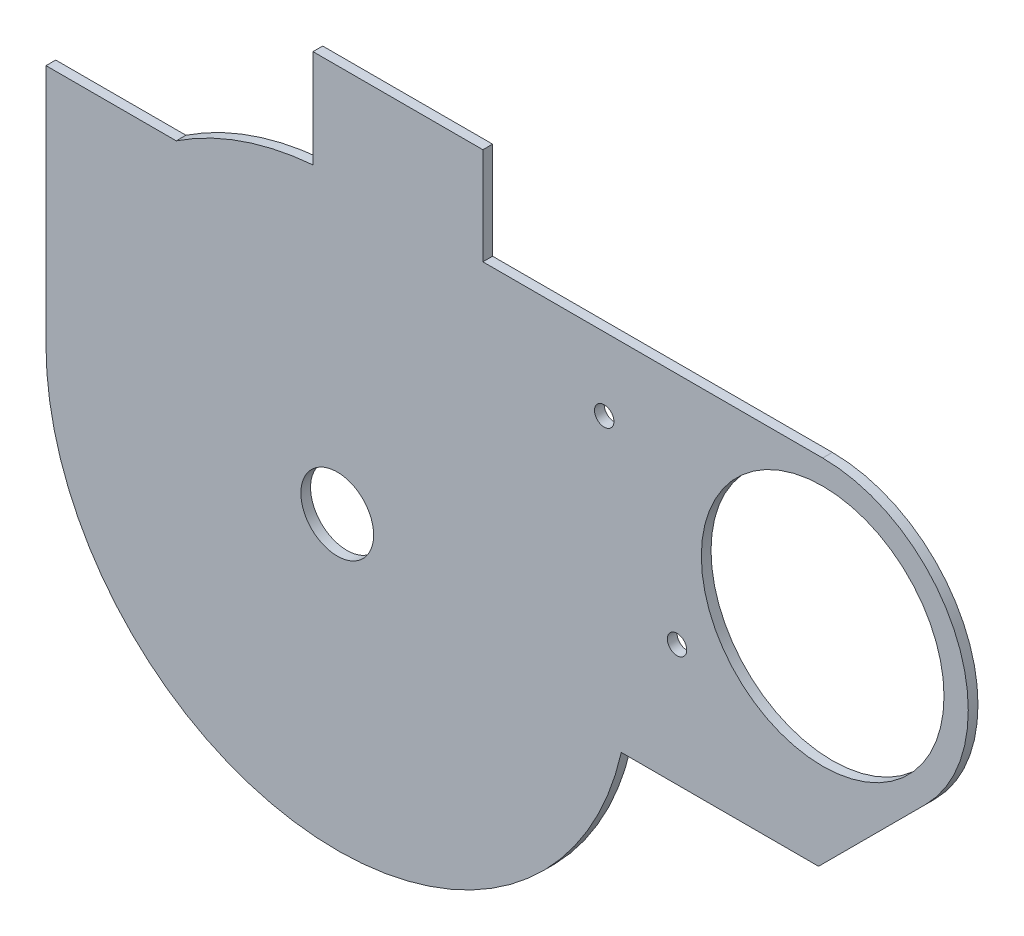
ISO-10303-21;
HEADER;
FILE_DESCRIPTION(('STEP AP214'),'2;1');
FILE_NAME('part.step','',(''),(''),'','','');
FILE_SCHEMA(('AUTOMOTIVE_DESIGN { 1 0 10303 214 1 1 1 1 }'));
ENDSEC;
DATA;
#1=APPLICATION_CONTEXT('core data for automotive mechanical design processes');
#2=APPLICATION_PROTOCOL_DEFINITION('international standard','automotive_design',2000,#1);
#3=PRODUCT_CONTEXT('',#1,'mechanical');
#4=PRODUCT('Part','Part','',(#3));
#5=PRODUCT_RELATED_PRODUCT_CATEGORY('part','',(#4));
#6=PRODUCT_DEFINITION_FORMATION('','',#4);
#7=PRODUCT_DEFINITION_CONTEXT('part definition',#1,'design');
#8=PRODUCT_DEFINITION('design','',#6,#7);
#9=PRODUCT_DEFINITION_SHAPE('','',#8);
#10=(LENGTH_UNIT() NAMED_UNIT(*) SI_UNIT(.MILLI.,.METRE.));
#11=(NAMED_UNIT(*) PLANE_ANGLE_UNIT() SI_UNIT($,.RADIAN.));
#12=(NAMED_UNIT(*) SI_UNIT($,.STERADIAN.) SOLID_ANGLE_UNIT());
#13=UNCERTAINTY_MEASURE_WITH_UNIT(LENGTH_MEASURE(1.E-05),#10,'distance_accuracy_value','');
#14=(GEOMETRIC_REPRESENTATION_CONTEXT(3) GLOBAL_UNCERTAINTY_ASSIGNED_CONTEXT((#13)) GLOBAL_UNIT_ASSIGNED_CONTEXT((#10,
#11,#12)) REPRESENTATION_CONTEXT('',''));
#15=CARTESIAN_POINT('',(0.,0.,0.));
#16=DIRECTION('',(0.,0.,1.));
#17=DIRECTION('',(1.,0.,0.));
#18=AXIS2_PLACEMENT_3D('',#15,#16,#17);
#19=CARTESIAN_POINT('',(0.,60.,2.));
#20=DIRECTION('',(0.,-1.,0.));
#21=DIRECTION('',(0.,0.,-1.));
#22=AXIS2_PLACEMENT_3D('',#19,#20,#21);
#23=PLANE('',#22);
#24=DIRECTION('',(0.,0.,-1.));
#25=VECTOR('',#24,1.);
#26=CARTESIAN_POINT('',(30.,60.,2.));
#27=LINE('',#26,#25);
#28=CARTESIAN_POINT('',(30.,60.,2.));
#29=VERTEX_POINT('',#28);
#30=CARTESIAN_POINT('',(30.,60.,0.));
#31=VERTEX_POINT('',#30);
#32=EDGE_CURVE('E307',#29,#31,#27,.T.);
#33=ORIENTED_EDGE('',*,*,#32,.F.);
#34=DIRECTION('',(-1.,0.,0.));
#35=VECTOR('',#34,1.);
#36=CARTESIAN_POINT('',(0.,60.,2.));
#37=LINE('',#36,#35);
#38=CARTESIAN_POINT('',(100.,60.,2.));
#39=VERTEX_POINT('',#38);
#40=EDGE_CURVE('E339',#39,#29,#37,.T.);
#41=ORIENTED_EDGE('',*,*,#40,.F.);
#42=DIRECTION('',(0.,0.,-1.));
#43=VECTOR('',#42,1.);
#44=CARTESIAN_POINT('',(100.,60.,2.));
#45=LINE('',#44,#43);
#46=CARTESIAN_POINT('',(100.,60.,0.));
#47=VERTEX_POINT('',#46);
#48=EDGE_CURVE('E376',#39,#47,#45,.T.);
#49=ORIENTED_EDGE('',*,*,#48,.T.);
#50=DIRECTION('',(-1.,0.,0.));
#51=VECTOR('',#50,1.);
#52=CARTESIAN_POINT('',(0.,60.,0.));
#53=LINE('',#52,#51);
#54=EDGE_CURVE('E362',#47,#31,#53,.T.);
#55=ORIENTED_EDGE('',*,*,#54,.T.);
#56=EDGE_LOOP('',(#33,#41,#49,#55));
#57=FACE_BOUND('',#56,.T.);
#58=ADVANCED_FACE('F37',(#57),#23,.F.);
#59=CARTESIAN_POINT('',(0.,0.,2.));
#60=DIRECTION('',(0.,0.,-1.));
#61=DIRECTION('',(-1.,0.,0.));
#62=AXIS2_PLACEMENT_3D('',#59,#60,#61);
#63=CYLINDRICAL_SURFACE('',#62,60.);
#64=DIRECTION('',(0.,0.,-1.));
#65=VECTOR('',#64,1.);
#66=CARTESIAN_POINT('',(-5.00000000022148,59.7913037154885,2.));
#67=LINE('',#66,#65);
#68=CARTESIAN_POINT('',(-5.00000000022148,59.7913037154885,2.));
#69=VERTEX_POINT('',#68);
#70=CARTESIAN_POINT('',(-5.00000000022148,59.7913037154885,0.));
#71=VERTEX_POINT('',#70);
#72=EDGE_CURVE('E304',#69,#71,#67,.T.);
#73=ORIENTED_EDGE('',*,*,#72,.T.);
#74=CARTESIAN_POINT('',(0.,0.,0.));
#75=DIRECTION('',(0.,0.,1.));
#76=DIRECTION('',(1.,0.,0.));
#77=AXIS2_PLACEMENT_3D('',#74,#75,#76);
#78=CIRCLE('',#77,60.);
#79=CARTESIAN_POINT('',(-33.166247903554,50.,0.));
#80=VERTEX_POINT('',#79);
#81=EDGE_CURVE('E356',#71,#80,#78,.T.);
#82=ORIENTED_EDGE('',*,*,#81,.T.);
#83=DIRECTION('',(0.,0.,-1.));
#84=VECTOR('',#83,1.);
#85=CARTESIAN_POINT('',(-33.166247903554,50.,2.));
#86=LINE('',#85,#84);
#87=CARTESIAN_POINT('',(-33.166247903554,50.,2.));
#88=VERTEX_POINT('',#87);
#89=EDGE_CURVE('E373',#88,#80,#86,.T.);
#90=ORIENTED_EDGE('',*,*,#89,.F.);
#91=CARTESIAN_POINT('',(0.,0.,2.));
#92=DIRECTION('',(0.,0.,1.));
#93=DIRECTION('',(1.,0.,0.));
#94=AXIS2_PLACEMENT_3D('',#91,#92,#93);
#95=CIRCLE('',#94,60.);
#96=EDGE_CURVE('E60',#69,#88,#95,.T.);
#97=ORIENTED_EDGE('',*,*,#96,.F.);
#98=EDGE_LOOP('',(#73,#82,#90,#97));
#99=FACE_BOUND('',#98,.T.);
#100=ADVANCED_FACE('F424',(#99),#63,.T.);
#101=CARTESIAN_POINT('',(-60.,0.,2.));
#102=DIRECTION('',(-1.,0.,0.));
#103=DIRECTION('',(0.,0.,1.));
#104=AXIS2_PLACEMENT_3D('',#101,#102,#103);
#105=PLANE('',#104);
#106=DIRECTION('',(0.,1.,0.));
#107=VECTOR('',#106,1.);
#108=CARTESIAN_POINT('',(-60.,0.,0.));
#109=LINE('',#108,#107);
#110=CARTESIAN_POINT('',(-60.,0.,0.));
#111=VERTEX_POINT('',#110);
#112=CARTESIAN_POINT('',(-60.,50.,0.));
#113=VERTEX_POINT('',#112);
#114=EDGE_CURVE('E322',#111,#113,#109,.T.);
#115=ORIENTED_EDGE('',*,*,#114,.F.);
#116=DIRECTION('',(0.,0.,-1.));
#117=VECTOR('',#116,1.);
#118=CARTESIAN_POINT('',(-60.,0.,2.));
#119=LINE('',#118,#117);
#120=CARTESIAN_POINT('',(-60.,0.,2.));
#121=VERTEX_POINT('',#120);
#122=EDGE_CURVE('E11',#121,#111,#119,.T.);
#123=ORIENTED_EDGE('',*,*,#122,.F.);
#124=DIRECTION('',(0.,1.,0.));
#125=VECTOR('',#124,1.);
#126=CARTESIAN_POINT('',(-60.,0.,2.));
#127=LINE('',#126,#125);
#128=CARTESIAN_POINT('',(-60.,50.,2.));
#129=VERTEX_POINT('',#128);
#130=EDGE_CURVE('E327',#121,#129,#127,.T.);
#131=ORIENTED_EDGE('',*,*,#130,.T.);
#132=DIRECTION('',(0.,0.,-1.));
#133=VECTOR('',#132,1.);
#134=CARTESIAN_POINT('',(-60.,50.,2.));
#135=LINE('',#134,#133);
#136=EDGE_CURVE('E350',#129,#113,#135,.T.);
#137=ORIENTED_EDGE('',*,*,#136,.T.);
#138=EDGE_LOOP('',(#115,#123,#131,#137));
#139=FACE_BOUND('',#138,.T.);
#140=ADVANCED_FACE('F39',(#139),#105,.T.);
#141=CARTESIAN_POINT('',(58.5132004184799,-13.2742373335269,0.));
#142=VERTEX_POINT('',#141);
#143=EDGE_CURVE('E353',#111,#142,#78,.T.);
#144=ORIENTED_EDGE('',*,*,#143,.T.);
#145=DIRECTION('',(0.,0.,-1.));
#146=VECTOR('',#145,1.);
#147=CARTESIAN_POINT('',(58.5132004184799,-13.2742373335269,2.));
#148=LINE('',#147,#146);
#149=CARTESIAN_POINT('',(58.5132004184799,-13.2742373335269,2.));
#150=VERTEX_POINT('',#149);
#151=EDGE_CURVE('E45',#150,#142,#148,.T.);
#152=ORIENTED_EDGE('',*,*,#151,.F.);
#153=EDGE_CURVE('E330',#121,#150,#95,.T.);
#154=ORIENTED_EDGE('',*,*,#153,.F.);
#155=ORIENTED_EDGE('',*,*,#122,.T.);
#156=EDGE_LOOP('',(#144,#152,#154,#155));
#157=FACE_BOUND('',#156,.T.);
#158=ADVANCED_FACE('F416',(#157),#63,.T.);
#159=CARTESIAN_POINT('',(0.,-13.2742373335269,2.));
#160=DIRECTION('',(0.,1.,0.));
#161=DIRECTION('',(-1.,0.,0.));
#162=AXIS2_PLACEMENT_3D('',#159,#160,#161);
#163=PLANE('',#162);
#164=DIRECTION('',(1.,0.,0.));
#165=VECTOR('',#164,1.);
#166=CARTESIAN_POINT('',(0.,-13.2742373335269,0.));
#167=LINE('',#166,#165);
#168=CARTESIAN_POINT('',(99.1521695376659,-13.2742373335269,0.));
#169=VERTEX_POINT('',#168);
#170=EDGE_CURVE('E355',#142,#169,#167,.T.);
#171=ORIENTED_EDGE('',*,*,#170,.T.);
#172=DIRECTION('',(0.,0.,-1.));
#173=VECTOR('',#172,1.);
#174=CARTESIAN_POINT('',(99.1521695376659,-13.2742373335269,2.));
#175=LINE('',#174,#173);
#176=CARTESIAN_POINT('',(99.1521695376659,-13.2742373335269,2.));
#177=VERTEX_POINT('',#176);
#178=EDGE_CURVE('E382',#177,#169,#175,.T.);
#179=ORIENTED_EDGE('',*,*,#178,.F.);
#180=DIRECTION('',(1.,0.,0.));
#181=VECTOR('',#180,1.);
#182=CARTESIAN_POINT('',(0.,-13.2742373335269,2.));
#183=LINE('',#182,#181);
#184=EDGE_CURVE('E333',#150,#177,#183,.T.);
#185=ORIENTED_EDGE('',*,*,#184,.F.);
#186=ORIENTED_EDGE('',*,*,#151,.T.);
#187=EDGE_LOOP('',(#171,#179,#185,#186));
#188=FACE_BOUND('',#187,.T.);
#189=ADVANCED_FACE('F389',(#188),#163,.F.);
#190=CARTESIAN_POINT('',(56.2132034355964,-56.2132034355964,2.));
#191=DIRECTION('',(-0.707106781186548,0.707106781186547,0.));
#192=DIRECTION('',(-0.707106781186547,-0.707106781186548,0.));
#193=AXIS2_PLACEMENT_3D('',#190,#191,#192);
#194=PLANE('',#193);
#195=DIRECTION('',(0.707106781186547,0.707106781186548,0.));
#196=VECTOR('',#195,1.);
#197=CARTESIAN_POINT('',(56.2132034355964,-56.2132034355964,0.));
#198=LINE('',#197,#196);
#199=CARTESIAN_POINT('',(121.213203435596,8.7867965644036,0.));
#200=VERTEX_POINT('',#199);
#201=EDGE_CURVE('E358',#169,#200,#198,.T.);
#202=ORIENTED_EDGE('',*,*,#201,.T.);
#203=DIRECTION('',(0.,0.,-1.));
#204=VECTOR('',#203,1.);
#205=CARTESIAN_POINT('',(121.213203435596,8.7867965644036,2.));
#206=LINE('',#205,#204);
#207=CARTESIAN_POINT('',(121.213203435596,8.7867965644036,2.));
#208=VERTEX_POINT('',#207);
#209=EDGE_CURVE('E379',#208,#200,#206,.T.);
#210=ORIENTED_EDGE('',*,*,#209,.F.);
#211=DIRECTION('',(0.707106781186547,0.707106781186548,0.));
#212=VECTOR('',#211,1.);
#213=CARTESIAN_POINT('',(56.2132034355964,-56.2132034355964,2.));
#214=LINE('',#213,#212);
#215=EDGE_CURVE('E335',#177,#208,#214,.T.);
#216=ORIENTED_EDGE('',*,*,#215,.F.);
#217=ORIENTED_EDGE('',*,*,#178,.T.);
#218=EDGE_LOOP('',(#202,#210,#216,#217));
#219=FACE_BOUND('',#218,.T.);
#220=ADVANCED_FACE('F404',(#219),#194,.F.);
#221=CARTESIAN_POINT('',(100.,30.,2.));
#222=DIRECTION('',(0.,0.,-1.));
#223=DIRECTION('',(-1.,0.,0.));
#224=AXIS2_PLACEMENT_3D('',#221,#222,#223);
#225=CYLINDRICAL_SURFACE('',#224,30.);
#226=CARTESIAN_POINT('',(100.,30.,0.));
#227=DIRECTION('',(0.,0.,1.));
#228=DIRECTION('',(1.,0.,0.));
#229=AXIS2_PLACEMENT_3D('',#226,#227,#228);
#230=CIRCLE('',#229,30.);
#231=EDGE_CURVE('E360',#200,#47,#230,.T.);
#232=ORIENTED_EDGE('',*,*,#231,.T.);
#233=ORIENTED_EDGE('',*,*,#48,.F.);
#234=CARTESIAN_POINT('',(100.,30.,2.));
#235=DIRECTION('',(0.,0.,1.));
#236=DIRECTION('',(1.,0.,0.));
#237=AXIS2_PLACEMENT_3D('',#234,#235,#236);
#238=CIRCLE('',#237,30.);
#239=EDGE_CURVE('E337',#208,#39,#238,.T.);
#240=ORIENTED_EDGE('',*,*,#239,.F.);
#241=ORIENTED_EDGE('',*,*,#209,.T.);
#242=EDGE_LOOP('',(#232,#233,#240,#241));
#243=FACE_BOUND('',#242,.T.);
#244=ADVANCED_FACE('F408',(#243),#225,.T.);
#245=CARTESIAN_POINT('',(100.,30.,2.));
#246=DIRECTION('',(0.,0.,-1.));
#247=DIRECTION('',(-1.,0.,0.));
#248=AXIS2_PLACEMENT_3D('',#245,#246,#247);
#249=CYLINDRICAL_SURFACE('',#248,25.);
#250=CARTESIAN_POINT('',(100.,30.,2.));
#251=DIRECTION('',(0.,0.,1.));
#252=DIRECTION('',(1.,0.,0.));
#253=AXIS2_PLACEMENT_3D('',#250,#251,#252);
#254=CIRCLE('',#253,25.);
#255=CARTESIAN_POINT('',(125.,30.,2.));
#256=VERTEX_POINT('',#255);
#257=EDGE_CURVE('E344',#256,#256,#254,.T.);
#258=ORIENTED_EDGE('',*,*,#257,.T.);
#259=EDGE_LOOP('',(#258));
#260=FACE_BOUND('',#259,.T.);
#261=CARTESIAN_POINT('',(100.,30.,0.));
#262=DIRECTION('',(0.,0.,1.));
#263=DIRECTION('',(1.,0.,0.));
#264=AXIS2_PLACEMENT_3D('',#261,#262,#263);
#265=CIRCLE('',#264,25.);
#266=CARTESIAN_POINT('',(125.,30.,0.));
#267=VERTEX_POINT('',#266);
#268=EDGE_CURVE('E367',#267,#267,#265,.T.);
#269=ORIENTED_EDGE('',*,*,#268,.F.);
#270=EDGE_LOOP('',(#269));
#271=FACE_BOUND('',#270,.T.);
#272=ADVANCED_FACE('F450',(#260,#271),#249,.F.);
#273=CARTESIAN_POINT('',(0.,50.,2.));
#274=DIRECTION('',(0.,-1.,0.));
#275=DIRECTION('',(0.,0.,-1.));
#276=AXIS2_PLACEMENT_3D('',#273,#274,#275);
#277=PLANE('',#276);
#278=DIRECTION('',(-1.,0.,0.));
#279=VECTOR('',#278,1.);
#280=CARTESIAN_POINT('',(0.,50.,0.));
#281=LINE('',#280,#279);
#282=EDGE_CURVE('E364',#80,#113,#281,.T.);
#283=ORIENTED_EDGE('',*,*,#282,.T.);
#284=ORIENTED_EDGE('',*,*,#136,.F.);
#285=DIRECTION('',(-1.,0.,0.));
#286=VECTOR('',#285,1.);
#287=CARTESIAN_POINT('',(0.,50.,2.));
#288=LINE('',#287,#286);
#289=EDGE_CURVE('E342',#88,#129,#288,.T.);
#290=ORIENTED_EDGE('',*,*,#289,.F.);
#291=ORIENTED_EDGE('',*,*,#89,.T.);
#292=EDGE_LOOP('',(#283,#284,#290,#291));
#293=FACE_BOUND('',#292,.T.);
#294=ADVANCED_FACE('F422',(#293),#277,.F.);
#295=CARTESIAN_POINT('',(0.,0.,2.));
#296=DIRECTION('',(0.,0.,-1.));
#297=DIRECTION('',(-1.,0.,0.));
#298=AXIS2_PLACEMENT_3D('',#295,#296,#297);
#299=CYLINDRICAL_SURFACE('',#298,7.5);
#300=CARTESIAN_POINT('',(0.,0.,2.));
#301=DIRECTION('',(0.,0.,1.));
#302=DIRECTION('',(1.,0.,0.));
#303=AXIS2_PLACEMENT_3D('',#300,#301,#302);
#304=CIRCLE('',#303,7.5);
#305=CARTESIAN_POINT('',(7.5,0.,2.));
#306=VERTEX_POINT('',#305);
#307=EDGE_CURVE('E347',#306,#306,#304,.T.);
#308=ORIENTED_EDGE('',*,*,#307,.T.);
#309=EDGE_LOOP('',(#308));
#310=FACE_BOUND('',#309,.T.);
#311=CARTESIAN_POINT('',(0.,0.,0.));
#312=DIRECTION('',(0.,0.,1.));
#313=DIRECTION('',(1.,0.,0.));
#314=AXIS2_PLACEMENT_3D('',#311,#312,#313);
#315=CIRCLE('',#314,7.5);
#316=CARTESIAN_POINT('',(7.5,0.,0.));
#317=VERTEX_POINT('',#316);
#318=EDGE_CURVE('E331',#317,#317,#315,.T.);
#319=ORIENTED_EDGE('',*,*,#318,.F.);
#320=EDGE_LOOP('',(#319));
#321=FACE_BOUND('',#320,.T.);
#322=ADVANCED_FACE('F499',(#310,#321),#299,.F.);
#323=CARTESIAN_POINT('',(0.,0.,2.));
#324=DIRECTION('',(0.,0.,1.));
#325=DIRECTION('',(1.,0.,0.));
#326=AXIS2_PLACEMENT_3D('',#323,#324,#325);
#327=PLANE('',#326);
#328=DIRECTION('',(0.,-1.,0.));
#329=VECTOR('',#328,1.);
#330=CARTESIAN_POINT('',(-5.00000000022149,0.,2.));
#331=LINE('',#330,#329);
#332=CARTESIAN_POINT('',(-5.00000000022147,80.,2.));
#333=VERTEX_POINT('',#332);
#334=EDGE_CURVE('E291',#333,#69,#331,.T.);
#335=ORIENTED_EDGE('',*,*,#334,.T.);
#336=ORIENTED_EDGE('',*,*,#96,.T.);
#337=ORIENTED_EDGE('',*,*,#289,.T.);
#338=ORIENTED_EDGE('',*,*,#130,.F.);
#339=ORIENTED_EDGE('',*,*,#153,.T.);
#340=ORIENTED_EDGE('',*,*,#184,.T.);
#341=ORIENTED_EDGE('',*,*,#215,.T.);
#342=ORIENTED_EDGE('',*,*,#239,.T.);
#343=ORIENTED_EDGE('',*,*,#40,.T.);
#344=DIRECTION('',(0.,1.,0.));
#345=VECTOR('',#344,1.);
#346=CARTESIAN_POINT('',(30.,0.,2.));
#347=LINE('',#346,#345);
#348=CARTESIAN_POINT('',(30.,80.,2.));
#349=VERTEX_POINT('',#348);
#350=EDGE_CURVE('E296',#29,#349,#347,.T.);
#351=ORIENTED_EDGE('',*,*,#350,.T.);
#352=DIRECTION('',(-1.,0.,0.));
#353=VECTOR('',#352,1.);
#354=CARTESIAN_POINT('',(0.,80.,2.));
#355=LINE('',#354,#353);
#356=EDGE_CURVE('E293',#349,#333,#355,.T.);
#357=ORIENTED_EDGE('',*,*,#356,.T.);
#358=EDGE_LOOP('',(#335,#336,#337,#338,#339,#340,#341,#342,#343,#351,#357));
#359=FACE_BOUND('',#358,.T.);
#360=CARTESIAN_POINT('',(55.,45.,2.));
#361=DIRECTION('',(0.,0.,1.));
#362=DIRECTION('',(1.,0.,0.));
#363=AXIS2_PLACEMENT_3D('',#360,#361,#362);
#364=CIRCLE('',#363,2.);
#365=CARTESIAN_POINT('',(57.,45.,2.));
#366=VERTEX_POINT('',#365);
#367=EDGE_CURVE('E315',#366,#366,#364,.T.);
#368=ORIENTED_EDGE('',*,*,#367,.F.);
#369=EDGE_LOOP('',(#368));
#370=FACE_BOUND('',#369,.T.);
#371=CARTESIAN_POINT('',(70.,11.7257626664731,2.));
#372=DIRECTION('',(0.,0.,1.));
#373=DIRECTION('',(1.,0.,0.));
#374=AXIS2_PLACEMENT_3D('',#371,#372,#373);
#375=CIRCLE('',#374,2.);
#376=CARTESIAN_POINT('',(72.,11.7257626664731,2.));
#377=VERTEX_POINT('',#376);
#378=EDGE_CURVE('E319',#377,#377,#375,.T.);
#379=ORIENTED_EDGE('',*,*,#378,.F.);
#380=EDGE_LOOP('',(#379));
#381=FACE_BOUND('',#380,.T.);
#382=ORIENTED_EDGE('',*,*,#257,.F.);
#383=EDGE_LOOP('',(#382));
#384=FACE_BOUND('',#383,.T.);
#385=ORIENTED_EDGE('',*,*,#307,.F.);
#386=EDGE_LOOP('',(#385));
#387=FACE_BOUND('',#386,.T.);
#388=ADVANCED_FACE('F412',(#359,#370,#381,#384,#387),#327,.T.);
#389=CARTESIAN_POINT('',(0.,0.,0.));
#390=DIRECTION('',(0.,0.,1.));
#391=DIRECTION('',(1.,0.,0.));
#392=AXIS2_PLACEMENT_3D('',#389,#390,#391);
#393=PLANE('',#392);
#394=DIRECTION('',(-1.,0.,0.));
#395=VECTOR('',#394,1.);
#396=CARTESIAN_POINT('',(0.,72.0960878291817,0.));
#397=LINE('',#396,#395);
#398=CARTESIAN_POINT('',(13.4999999998893,72.0960878291817,0.));
#399=VERTEX_POINT('',#398);
#400=CARTESIAN_POINT('',(11.4999999998893,72.0960878291817,0.));
#401=VERTEX_POINT('',#400);
#402=EDGE_CURVE('E242',#399,#401,#397,.T.);
#403=ORIENTED_EDGE('',*,*,#402,.T.);
#404=DIRECTION('',(0.,-1.,0.));
#405=VECTOR('',#404,1.);
#406=CARTESIAN_POINT('',(11.4999999998892,0.,0.));
#407=LINE('',#406,#405);
#408=CARTESIAN_POINT('',(11.4999999998893,65.5960878291817,0.));
#409=VERTEX_POINT('',#408);
#410=EDGE_CURVE('E197',#401,#409,#407,.T.);
#411=ORIENTED_EDGE('',*,*,#410,.T.);
#412=DIRECTION('',(-1.,0.,0.));
#413=VECTOR('',#412,1.);
#414=CARTESIAN_POINT('',(0.,65.5960878291817,0.));
#415=LINE('',#414,#413);
#416=CARTESIAN_POINT('',(4.99999999988926,65.5960878291817,0.));
#417=VERTEX_POINT('',#416);
#418=EDGE_CURVE('E212',#409,#417,#415,.T.);
#419=ORIENTED_EDGE('',*,*,#418,.T.);
#420=DIRECTION('',(0.,-1.,0.));
#421=VECTOR('',#420,1.);
#422=CARTESIAN_POINT('',(4.99999999988926,0.,0.));
#423=LINE('',#422,#421);
#424=CARTESIAN_POINT('',(4.99999999988926,63.5960878291817,0.));
#425=VERTEX_POINT('',#424);
#426=EDGE_CURVE('E52',#417,#425,#423,.T.);
#427=ORIENTED_EDGE('',*,*,#426,.T.);
#428=DIRECTION('',(-1.,0.,0.));
#429=VECTOR('',#428,1.);
#430=CARTESIAN_POINT('',(0.,63.5960878291817,0.));
#431=LINE('',#430,#429);
#432=CARTESIAN_POINT('',(11.4999999998893,63.5960878291817,0.));
#433=VERTEX_POINT('',#432);
#434=EDGE_CURVE('E262',#433,#425,#431,.T.);
#435=ORIENTED_EDGE('',*,*,#434,.F.);
#436=DIRECTION('',(0.,-1.,0.));
#437=VECTOR('',#436,1.);
#438=CARTESIAN_POINT('',(11.4999999998892,0.,0.));
#439=LINE('',#438,#437);
#440=CARTESIAN_POINT('',(11.4999999998893,57.0960878291817,0.));
#441=VERTEX_POINT('',#440);
#442=EDGE_CURVE('E259',#433,#441,#439,.T.);
#443=ORIENTED_EDGE('',*,*,#442,.T.);
#444=DIRECTION('',(-1.,0.,0.));
#445=VECTOR('',#444,1.);
#446=CARTESIAN_POINT('',(0.,57.0960878291817,0.));
#447=LINE('',#446,#445);
#448=CARTESIAN_POINT('',(13.4999999998893,57.0960878291817,0.));
#449=VERTEX_POINT('',#448);
#450=EDGE_CURVE('E256',#449,#441,#447,.T.);
#451=ORIENTED_EDGE('',*,*,#450,.F.);
#452=DIRECTION('',(0.,-1.,0.));
#453=VECTOR('',#452,1.);
#454=CARTESIAN_POINT('',(13.4999999998893,0.,0.));
#455=LINE('',#454,#453);
#456=CARTESIAN_POINT('',(13.4999999998893,63.5960878291817,0.));
#457=VERTEX_POINT('',#456);
#458=EDGE_CURVE('E254',#457,#449,#455,.T.);
#459=ORIENTED_EDGE('',*,*,#458,.F.);
#460=DIRECTION('',(-1.,0.,0.));
#461=VECTOR('',#460,1.);
#462=CARTESIAN_POINT('',(0.,63.5960878291817,0.));
#463=LINE('',#462,#461);
#464=CARTESIAN_POINT('',(19.9999999998893,63.5960878291817,0.));
#465=VERTEX_POINT('',#464);
#466=EDGE_CURVE('E252',#465,#457,#463,.T.);
#467=ORIENTED_EDGE('',*,*,#466,.F.);
#468=DIRECTION('',(0.,-1.,0.));
#469=VECTOR('',#468,1.);
#470=CARTESIAN_POINT('',(19.9999999998893,0.,0.));
#471=LINE('',#470,#469);
#472=CARTESIAN_POINT('',(19.9999999998893,65.5960878291817,0.));
#473=VERTEX_POINT('',#472);
#474=EDGE_CURVE('E250',#473,#465,#471,.T.);
#475=ORIENTED_EDGE('',*,*,#474,.F.);
#476=DIRECTION('',(-1.,0.,0.));
#477=VECTOR('',#476,1.);
#478=CARTESIAN_POINT('',(0.,65.5960878291817,0.));
#479=LINE('',#478,#477);
#480=CARTESIAN_POINT('',(13.4999999998893,65.5960878291817,0.));
#481=VERTEX_POINT('',#480);
#482=EDGE_CURVE('E247',#473,#481,#479,.T.);
#483=ORIENTED_EDGE('',*,*,#482,.T.);
#484=DIRECTION('',(0.,-1.,0.));
#485=VECTOR('',#484,1.);
#486=CARTESIAN_POINT('',(13.4999999998893,0.,0.));
#487=LINE('',#486,#485);
#488=EDGE_CURVE('E244',#399,#481,#487,.T.);
#489=ORIENTED_EDGE('',*,*,#488,.F.);
#490=EDGE_LOOP('',(#403,#411,#419,#427,#435,#443,#451,#459,#467,#475,#483,#489));
#491=FACE_BOUND('',#490,.T.);
#492=ORIENTED_EDGE('',*,*,#81,.F.);
#493=DIRECTION('',(0.,-1.,0.));
#494=VECTOR('',#493,1.);
#495=CARTESIAN_POINT('',(-5.00000000022149,0.,0.));
#496=LINE('',#495,#494);
#497=CARTESIAN_POINT('',(-5.00000000022147,80.,0.));
#498=VERTEX_POINT('',#497);
#499=EDGE_CURVE('E202',#498,#71,#496,.T.);
#500=ORIENTED_EDGE('',*,*,#499,.F.);
#501=DIRECTION('',(-1.,0.,0.));
#502=VECTOR('',#501,1.);
#503=CARTESIAN_POINT('',(0.,80.,0.));
#504=LINE('',#503,#502);
#505=CARTESIAN_POINT('',(30.,80.,0.));
#506=VERTEX_POINT('',#505);
#507=EDGE_CURVE('E301',#506,#498,#504,.T.);
#508=ORIENTED_EDGE('',*,*,#507,.F.);
#509=DIRECTION('',(0.,1.,0.));
#510=VECTOR('',#509,1.);
#511=CARTESIAN_POINT('',(30.,0.,0.));
#512=LINE('',#511,#510);
#513=EDGE_CURVE('E294',#31,#506,#512,.T.);
#514=ORIENTED_EDGE('',*,*,#513,.F.);
#515=ORIENTED_EDGE('',*,*,#54,.F.);
#516=ORIENTED_EDGE('',*,*,#231,.F.);
#517=ORIENTED_EDGE('',*,*,#201,.F.);
#518=ORIENTED_EDGE('',*,*,#170,.F.);
#519=ORIENTED_EDGE('',*,*,#143,.F.);
#520=ORIENTED_EDGE('',*,*,#114,.T.);
#521=ORIENTED_EDGE('',*,*,#282,.F.);
#522=EDGE_LOOP('',(#492,#500,#508,#514,#515,#516,#517,#518,#519,#520,#521));
#523=FACE_BOUND('',#522,.T.);
#524=CARTESIAN_POINT('',(55.,45.,0.));
#525=DIRECTION('',(0.,0.,1.));
#526=DIRECTION('',(1.,0.,0.));
#527=AXIS2_PLACEMENT_3D('',#524,#525,#526);
#528=CIRCLE('',#527,2.);
#529=CARTESIAN_POINT('',(57.,45.,0.));
#530=VERTEX_POINT('',#529);
#531=EDGE_CURVE('E318',#530,#530,#528,.F.);
#532=ORIENTED_EDGE('',*,*,#531,.F.);
#533=EDGE_LOOP('',(#532));
#534=FACE_BOUND('',#533,.T.);
#535=CARTESIAN_POINT('',(70.,11.7257626664731,0.));
#536=DIRECTION('',(0.,0.,1.));
#537=DIRECTION('',(1.,0.,0.));
#538=AXIS2_PLACEMENT_3D('',#535,#536,#537);
#539=CIRCLE('',#538,2.);
#540=CARTESIAN_POINT('',(72.,11.7257626664731,0.));
#541=VERTEX_POINT('',#540);
#542=EDGE_CURVE('E306',#541,#541,#539,.F.);
#543=ORIENTED_EDGE('',*,*,#542,.F.);
#544=EDGE_LOOP('',(#543));
#545=FACE_BOUND('',#544,.T.);
#546=ORIENTED_EDGE('',*,*,#268,.T.);
#547=EDGE_LOOP('',(#546));
#548=FACE_BOUND('',#547,.T.);
#549=ORIENTED_EDGE('',*,*,#318,.T.);
#550=EDGE_LOOP('',(#549));
#551=FACE_BOUND('',#550,.T.);
#552=ADVANCED_FACE('F397',(#491,#523,#534,#545,#548,#551),#393,.F.);
#553=CARTESIAN_POINT('',(70.,11.7257626664731,-0.00100000000000013));
#554=DIRECTION('',(0.,0.,1.));
#555=DIRECTION('',(1.,0.,0.));
#556=AXIS2_PLACEMENT_3D('',#553,#554,#555);
#557=CYLINDRICAL_SURFACE('',#556,2.);
#558=ORIENTED_EDGE('',*,*,#378,.T.);
#559=EDGE_LOOP('',(#558));
#560=FACE_BOUND('',#559,.T.);
#561=ORIENTED_EDGE('',*,*,#542,.T.);
#562=EDGE_LOOP('',(#561));
#563=FACE_BOUND('',#562,.T.);
#564=ADVANCED_FACE('F514',(#560,#563),#557,.F.);
#565=CARTESIAN_POINT('',(55.,45.,-0.00100000000000013));
#566=DIRECTION('',(0.,0.,1.));
#567=DIRECTION('',(1.,0.,0.));
#568=AXIS2_PLACEMENT_3D('',#565,#566,#567);
#569=CYLINDRICAL_SURFACE('',#568,2.);
#570=ORIENTED_EDGE('',*,*,#367,.T.);
#571=EDGE_LOOP('',(#570));
#572=FACE_BOUND('',#571,.T.);
#573=ORIENTED_EDGE('',*,*,#531,.T.);
#574=EDGE_LOOP('',(#573));
#575=FACE_BOUND('',#574,.T.);
#576=ADVANCED_FACE('F517',(#572,#575),#569,.F.);
#577=CARTESIAN_POINT('',(-5.00000000022149,0.,2.));
#578=DIRECTION('',(1.,0.,0.));
#579=DIRECTION('',(0.,1.,0.));
#580=AXIS2_PLACEMENT_3D('',#577,#578,#579);
#581=PLANE('',#580);
#582=ORIENTED_EDGE('',*,*,#499,.T.);
#583=ORIENTED_EDGE('',*,*,#72,.F.);
#584=ORIENTED_EDGE('',*,*,#334,.F.);
#585=DIRECTION('',(0.,0.,-1.));
#586=VECTOR('',#585,1.);
#587=CARTESIAN_POINT('',(-5.00000000022147,80.,2.));
#588=LINE('',#587,#586);
#589=EDGE_CURVE('E298',#333,#498,#588,.T.);
#590=ORIENTED_EDGE('',*,*,#589,.T.);
#591=EDGE_LOOP('',(#582,#583,#584,#590));
#592=FACE_BOUND('',#591,.T.);
#593=ADVANCED_FACE('F428',(#592),#581,.F.);
#594=CARTESIAN_POINT('',(30.,0.,2.));
#595=DIRECTION('',(-1.,0.,0.));
#596=DIRECTION('',(0.,0.,1.));
#597=AXIS2_PLACEMENT_3D('',#594,#595,#596);
#598=PLANE('',#597);
#599=ORIENTED_EDGE('',*,*,#513,.T.);
#600=DIRECTION('',(0.,0.,-1.));
#601=VECTOR('',#600,1.);
#602=CARTESIAN_POINT('',(30.,80.,2.));
#603=LINE('',#602,#601);
#604=EDGE_CURVE('E310',#349,#506,#603,.T.);
#605=ORIENTED_EDGE('',*,*,#604,.F.);
#606=ORIENTED_EDGE('',*,*,#350,.F.);
#607=ORIENTED_EDGE('',*,*,#32,.T.);
#608=EDGE_LOOP('',(#599,#605,#606,#607));
#609=FACE_BOUND('',#608,.T.);
#610=ADVANCED_FACE('F437',(#609),#598,.F.);
#611=CARTESIAN_POINT('',(0.,80.,2.));
#612=DIRECTION('',(0.,-1.,0.));
#613=DIRECTION('',(0.,0.,-1.));
#614=AXIS2_PLACEMENT_3D('',#611,#612,#613);
#615=PLANE('',#614);
#616=ORIENTED_EDGE('',*,*,#507,.T.);
#617=ORIENTED_EDGE('',*,*,#589,.F.);
#618=ORIENTED_EDGE('',*,*,#356,.F.);
#619=ORIENTED_EDGE('',*,*,#604,.T.);
#620=EDGE_LOOP('',(#616,#617,#618,#619));
#621=FACE_BOUND('',#620,.T.);
#622=ADVANCED_FACE('F433',(#621),#615,.F.);
#623=CARTESIAN_POINT('',(11.4999999998892,0.,-1.));
#624=DIRECTION('',(-1.,0.,0.));
#625=DIRECTION('',(0.,-1.,0.));
#626=AXIS2_PLACEMENT_3D('',#623,#624,#625);
#627=PLANE('',#626);
#628=ORIENTED_EDGE('',*,*,#410,.F.);
#629=DIRECTION('',(0.,0.,1.));
#630=VECTOR('',#629,1.);
#631=CARTESIAN_POINT('',(11.4999999998893,72.0960878291817,-1.));
#632=LINE('',#631,#630);
#633=CARTESIAN_POINT('',(11.4999999998893,72.0960878291817,-1.));
#634=VERTEX_POINT('',#633);
#635=EDGE_CURVE('E191',#634,#401,#632,.T.);
#636=ORIENTED_EDGE('',*,*,#635,.F.);
#637=DIRECTION('',(0.,-1.,0.));
#638=VECTOR('',#637,1.);
#639=CARTESIAN_POINT('',(11.4999999998892,0.,-1.));
#640=LINE('',#639,#638);
#641=CARTESIAN_POINT('',(11.4999999998893,65.5960878291817,-1.));
#642=VERTEX_POINT('',#641);
#643=EDGE_CURVE('E194',#634,#642,#640,.T.);
#644=ORIENTED_EDGE('',*,*,#643,.T.);
#645=DIRECTION('',(0.,0.,1.));
#646=VECTOR('',#645,1.);
#647=CARTESIAN_POINT('',(11.4999999998893,65.5960878291817,-1.));
#648=LINE('',#647,#646);
#649=EDGE_CURVE('E240',#642,#409,#648,.T.);
#650=ORIENTED_EDGE('',*,*,#649,.T.);
#651=EDGE_LOOP('',(#628,#636,#644,#650));
#652=FACE_BOUND('',#651,.T.);
#653=ADVANCED_FACE('F193',(#652),#627,.T.);
#654=CARTESIAN_POINT('',(0.,72.0960878291817,-1.));
#655=DIRECTION('',(0.,1.,0.));
#656=DIRECTION('',(0.,0.,1.));
#657=AXIS2_PLACEMENT_3D('',#654,#655,#656);
#658=PLANE('',#657);
#659=ORIENTED_EDGE('',*,*,#402,.F.);
#660=DIRECTION('',(0.,0.,1.));
#661=VECTOR('',#660,1.);
#662=CARTESIAN_POINT('',(13.4999999998893,72.0960878291817,-1.));
#663=LINE('',#662,#661);
#664=CARTESIAN_POINT('',(13.4999999998893,72.0960878291817,-1.));
#665=VERTEX_POINT('',#664);
#666=EDGE_CURVE('E203',#665,#399,#663,.T.);
#667=ORIENTED_EDGE('',*,*,#666,.F.);
#668=DIRECTION('',(-1.,0.,0.));
#669=VECTOR('',#668,1.);
#670=CARTESIAN_POINT('',(0.,72.0960878291817,-1.));
#671=LINE('',#670,#669);
#672=EDGE_CURVE('E208',#665,#634,#671,.T.);
#673=ORIENTED_EDGE('',*,*,#672,.T.);
#674=ORIENTED_EDGE('',*,*,#635,.T.);
#675=EDGE_LOOP('',(#659,#667,#673,#674));
#676=FACE_BOUND('',#675,.T.);
#677=ADVANCED_FACE('F214',(#676),#658,.T.);
#678=CARTESIAN_POINT('',(13.4999999998893,0.,-1.));
#679=DIRECTION('',(-1.,0.,0.));
#680=DIRECTION('',(0.,-1.,0.));
#681=AXIS2_PLACEMENT_3D('',#678,#679,#680);
#682=PLANE('',#681);
#683=ORIENTED_EDGE('',*,*,#488,.T.);
#684=DIRECTION('',(0.,0.,1.));
#685=VECTOR('',#684,1.);
#686=CARTESIAN_POINT('',(13.4999999998893,65.5960878291817,-1.));
#687=LINE('',#686,#685);
#688=CARTESIAN_POINT('',(13.4999999998893,65.5960878291817,-1.));
#689=VERTEX_POINT('',#688);
#690=EDGE_CURVE('E288',#689,#481,#687,.T.);
#691=ORIENTED_EDGE('',*,*,#690,.F.);
#692=DIRECTION('',(0.,-1.,0.));
#693=VECTOR('',#692,1.);
#694=CARTESIAN_POINT('',(13.4999999998893,0.,-1.));
#695=LINE('',#694,#693);
#696=EDGE_CURVE('E216',#665,#689,#695,.T.);
#697=ORIENTED_EDGE('',*,*,#696,.F.);
#698=ORIENTED_EDGE('',*,*,#666,.T.);
#699=EDGE_LOOP('',(#683,#691,#697,#698));
#700=FACE_BOUND('',#699,.T.);
#701=ADVANCED_FACE('F582',(#700),#682,.F.);
#702=CARTESIAN_POINT('',(0.,65.5960878291817,-1.));
#703=DIRECTION('',(0.,1.,0.));
#704=DIRECTION('',(0.,0.,1.));
#705=AXIS2_PLACEMENT_3D('',#702,#703,#704);
#706=PLANE('',#705);
#707=ORIENTED_EDGE('',*,*,#482,.F.);
#708=DIRECTION('',(0.,0.,1.));
#709=VECTOR('',#708,1.);
#710=CARTESIAN_POINT('',(19.9999999998893,65.5960878291817,-1.));
#711=LINE('',#710,#709);
#712=CARTESIAN_POINT('',(19.9999999998893,65.5960878291817,-1.));
#713=VERTEX_POINT('',#712);
#714=EDGE_CURVE('E286',#713,#473,#711,.T.);
#715=ORIENTED_EDGE('',*,*,#714,.F.);
#716=DIRECTION('',(-1.,0.,0.));
#717=VECTOR('',#716,1.);
#718=CARTESIAN_POINT('',(0.,65.5960878291817,-1.));
#719=LINE('',#718,#717);
#720=EDGE_CURVE('E218',#713,#689,#719,.T.);
#721=ORIENTED_EDGE('',*,*,#720,.T.);
#722=ORIENTED_EDGE('',*,*,#690,.T.);
#723=EDGE_LOOP('',(#707,#715,#721,#722));
#724=FACE_BOUND('',#723,.T.);
#725=ADVANCED_FACE('F589',(#724),#706,.T.);
#726=CARTESIAN_POINT('',(19.9999999998893,0.,-1.));
#727=DIRECTION('',(-1.,0.,0.));
#728=DIRECTION('',(0.,0.,1.));
#729=AXIS2_PLACEMENT_3D('',#726,#727,#728);
#730=PLANE('',#729);
#731=ORIENTED_EDGE('',*,*,#474,.T.);
#732=DIRECTION('',(0.,0.,1.));
#733=VECTOR('',#732,1.);
#734=CARTESIAN_POINT('',(19.9999999998893,63.5960878291817,-1.));
#735=LINE('',#734,#733);
#736=CARTESIAN_POINT('',(19.9999999998893,63.5960878291817,-1.));
#737=VERTEX_POINT('',#736);
#738=EDGE_CURVE('E283',#737,#465,#735,.T.);
#739=ORIENTED_EDGE('',*,*,#738,.F.);
#740=DIRECTION('',(0.,-1.,0.));
#741=VECTOR('',#740,1.);
#742=CARTESIAN_POINT('',(19.9999999998893,0.,-1.));
#743=LINE('',#742,#741);
#744=EDGE_CURVE('E223',#713,#737,#743,.T.);
#745=ORIENTED_EDGE('',*,*,#744,.F.);
#746=ORIENTED_EDGE('',*,*,#714,.T.);
#747=EDGE_LOOP('',(#731,#739,#745,#746));
#748=FACE_BOUND('',#747,.T.);
#749=ADVANCED_FACE('F597',(#748),#730,.F.);
#750=CARTESIAN_POINT('',(0.,63.5960878291817,-1.));
#751=DIRECTION('',(0.,1.,0.));
#752=DIRECTION('',(0.,0.,1.));
#753=AXIS2_PLACEMENT_3D('',#750,#751,#752);
#754=PLANE('',#753);
#755=ORIENTED_EDGE('',*,*,#466,.T.);
#756=DIRECTION('',(0.,0.,1.));
#757=VECTOR('',#756,1.);
#758=CARTESIAN_POINT('',(13.4999999998893,63.5960878291817,-1.));
#759=LINE('',#758,#757);
#760=CARTESIAN_POINT('',(13.4999999998893,63.5960878291817,-1.));
#761=VERTEX_POINT('',#760);
#762=EDGE_CURVE('E280',#761,#457,#759,.T.);
#763=ORIENTED_EDGE('',*,*,#762,.F.);
#764=DIRECTION('',(-1.,0.,0.));
#765=VECTOR('',#764,1.);
#766=CARTESIAN_POINT('',(0.,63.5960878291817,-1.));
#767=LINE('',#766,#765);
#768=EDGE_CURVE('E225',#737,#761,#767,.T.);
#769=ORIENTED_EDGE('',*,*,#768,.F.);
#770=ORIENTED_EDGE('',*,*,#738,.T.);
#771=EDGE_LOOP('',(#755,#763,#769,#770));
#772=FACE_BOUND('',#771,.T.);
#773=ADVANCED_FACE('F605',(#772),#754,.F.);
#774=CARTESIAN_POINT('',(13.4999999998893,0.,-1.));
#775=DIRECTION('',(-1.,0.,0.));
#776=DIRECTION('',(0.,-1.,0.));
#777=AXIS2_PLACEMENT_3D('',#774,#775,#776);
#778=PLANE('',#777);
#779=ORIENTED_EDGE('',*,*,#458,.T.);
#780=DIRECTION('',(0.,0.,1.));
#781=VECTOR('',#780,1.);
#782=CARTESIAN_POINT('',(13.4999999998893,57.0960878291817,-1.));
#783=LINE('',#782,#781);
#784=CARTESIAN_POINT('',(13.4999999998893,57.0960878291817,-1.));
#785=VERTEX_POINT('',#784);
#786=EDGE_CURVE('E277',#785,#449,#783,.T.);
#787=ORIENTED_EDGE('',*,*,#786,.F.);
#788=DIRECTION('',(0.,-1.,0.));
#789=VECTOR('',#788,1.);
#790=CARTESIAN_POINT('',(13.4999999998893,0.,-1.));
#791=LINE('',#790,#789);
#792=EDGE_CURVE('E227',#761,#785,#791,.T.);
#793=ORIENTED_EDGE('',*,*,#792,.F.);
#794=ORIENTED_EDGE('',*,*,#762,.T.);
#795=EDGE_LOOP('',(#779,#787,#793,#794));
#796=FACE_BOUND('',#795,.T.);
#797=ADVANCED_FACE('F613',(#796),#778,.F.);
#798=CARTESIAN_POINT('',(0.,57.0960878291817,-1.));
#799=DIRECTION('',(0.,1.,0.));
#800=DIRECTION('',(0.,0.,1.));
#801=AXIS2_PLACEMENT_3D('',#798,#799,#800);
#802=PLANE('',#801);
#803=ORIENTED_EDGE('',*,*,#450,.T.);
#804=DIRECTION('',(0.,0.,1.));
#805=VECTOR('',#804,1.);
#806=CARTESIAN_POINT('',(11.4999999998893,57.0960878291817,-1.));
#807=LINE('',#806,#805);
#808=CARTESIAN_POINT('',(11.4999999998893,57.0960878291817,-1.));
#809=VERTEX_POINT('',#808);
#810=EDGE_CURVE('E275',#809,#441,#807,.T.);
#811=ORIENTED_EDGE('',*,*,#810,.F.);
#812=DIRECTION('',(-1.,0.,0.));
#813=VECTOR('',#812,1.);
#814=CARTESIAN_POINT('',(0.,57.0960878291817,-1.));
#815=LINE('',#814,#813);
#816=EDGE_CURVE('E229',#785,#809,#815,.T.);
#817=ORIENTED_EDGE('',*,*,#816,.F.);
#818=ORIENTED_EDGE('',*,*,#786,.T.);
#819=EDGE_LOOP('',(#803,#811,#817,#818));
#820=FACE_BOUND('',#819,.T.);
#821=ADVANCED_FACE('F621',(#820),#802,.F.);
#822=CARTESIAN_POINT('',(11.4999999998892,0.,-1.));
#823=DIRECTION('',(-1.,0.,0.));
#824=DIRECTION('',(0.,-1.,0.));
#825=AXIS2_PLACEMENT_3D('',#822,#823,#824);
#826=PLANE('',#825);
#827=ORIENTED_EDGE('',*,*,#442,.F.);
#828=DIRECTION('',(0.,0.,1.));
#829=VECTOR('',#828,1.);
#830=CARTESIAN_POINT('',(11.4999999998893,63.5960878291817,-1.));
#831=LINE('',#830,#829);
#832=CARTESIAN_POINT('',(11.4999999998893,63.5960878291817,-1.));
#833=VERTEX_POINT('',#832);
#834=EDGE_CURVE('E273',#833,#433,#831,.T.);
#835=ORIENTED_EDGE('',*,*,#834,.F.);
#836=DIRECTION('',(0.,-1.,0.));
#837=VECTOR('',#836,1.);
#838=CARTESIAN_POINT('',(11.4999999998892,0.,-1.));
#839=LINE('',#838,#837);
#840=EDGE_CURVE('E231',#833,#809,#839,.T.);
#841=ORIENTED_EDGE('',*,*,#840,.T.);
#842=ORIENTED_EDGE('',*,*,#810,.T.);
#843=EDGE_LOOP('',(#827,#835,#841,#842));
#844=FACE_BOUND('',#843,.T.);
#845=ADVANCED_FACE('F629',(#844),#826,.T.);
#846=CARTESIAN_POINT('',(0.,63.5960878291817,-1.));
#847=DIRECTION('',(0.,1.,0.));
#848=DIRECTION('',(0.,0.,1.));
#849=AXIS2_PLACEMENT_3D('',#846,#847,#848);
#850=PLANE('',#849);
#851=ORIENTED_EDGE('',*,*,#434,.T.);
#852=DIRECTION('',(0.,0.,1.));
#853=VECTOR('',#852,1.);
#854=CARTESIAN_POINT('',(4.99999999988926,63.5960878291817,-1.));
#855=LINE('',#854,#853);
#856=CARTESIAN_POINT('',(4.99999999988926,63.5960878291817,-1.));
#857=VERTEX_POINT('',#856);
#858=EDGE_CURVE('E271',#857,#425,#855,.T.);
#859=ORIENTED_EDGE('',*,*,#858,.F.);
#860=DIRECTION('',(-1.,0.,0.));
#861=VECTOR('',#860,1.);
#862=CARTESIAN_POINT('',(0.,63.5960878291817,-1.));
#863=LINE('',#862,#861);
#864=EDGE_CURVE('E234',#833,#857,#863,.T.);
#865=ORIENTED_EDGE('',*,*,#864,.F.);
#866=ORIENTED_EDGE('',*,*,#834,.T.);
#867=EDGE_LOOP('',(#851,#859,#865,#866));
#868=FACE_BOUND('',#867,.T.);
#869=ADVANCED_FACE('F637',(#868),#850,.F.);
#870=CARTESIAN_POINT('',(4.99999999988926,0.,-1.));
#871=DIRECTION('',(-1.,0.,0.));
#872=DIRECTION('',(0.,0.,1.));
#873=AXIS2_PLACEMENT_3D('',#870,#871,#872);
#874=PLANE('',#873);
#875=ORIENTED_EDGE('',*,*,#426,.F.);
#876=DIRECTION('',(0.,0.,1.));
#877=VECTOR('',#876,1.);
#878=CARTESIAN_POINT('',(4.99999999988926,65.5960878291817,-1.));
#879=LINE('',#878,#877);
#880=CARTESIAN_POINT('',(4.99999999988926,65.5960878291817,-1.));
#881=VERTEX_POINT('',#880);
#882=EDGE_CURVE('E269',#881,#417,#879,.T.);
#883=ORIENTED_EDGE('',*,*,#882,.F.);
#884=DIRECTION('',(0.,-1.,0.));
#885=VECTOR('',#884,1.);
#886=CARTESIAN_POINT('',(4.99999999988926,0.,-1.));
#887=LINE('',#886,#885);
#888=EDGE_CURVE('E236',#881,#857,#887,.T.);
#889=ORIENTED_EDGE('',*,*,#888,.T.);
#890=ORIENTED_EDGE('',*,*,#858,.T.);
#891=EDGE_LOOP('',(#875,#883,#889,#890));
#892=FACE_BOUND('',#891,.T.);
#893=ADVANCED_FACE('F645',(#892),#874,.T.);
#894=CARTESIAN_POINT('',(0.,65.5960878291817,-1.));
#895=DIRECTION('',(0.,1.,0.));
#896=DIRECTION('',(0.,0.,1.));
#897=AXIS2_PLACEMENT_3D('',#894,#895,#896);
#898=PLANE('',#897);
#899=ORIENTED_EDGE('',*,*,#418,.F.);
#900=ORIENTED_EDGE('',*,*,#649,.F.);
#901=DIRECTION('',(-1.,0.,0.));
#902=VECTOR('',#901,1.);
#903=CARTESIAN_POINT('',(0.,65.5960878291817,-1.));
#904=LINE('',#903,#902);
#905=EDGE_CURVE('E211',#642,#881,#904,.T.);
#906=ORIENTED_EDGE('',*,*,#905,.T.);
#907=ORIENTED_EDGE('',*,*,#882,.T.);
#908=EDGE_LOOP('',(#899,#900,#906,#907));
#909=FACE_BOUND('',#908,.T.);
#910=ADVANCED_FACE('F653',(#909),#898,.T.);
#911=CARTESIAN_POINT('',(0.,0.,-1.));
#912=DIRECTION('',(0.,0.,-1.));
#913=DIRECTION('',(-1.,0.,0.));
#914=AXIS2_PLACEMENT_3D('',#911,#912,#913);
#915=PLANE('',#914);
#916=ORIENTED_EDGE('',*,*,#643,.F.);
#917=ORIENTED_EDGE('',*,*,#672,.F.);
#918=ORIENTED_EDGE('',*,*,#696,.T.);
#919=ORIENTED_EDGE('',*,*,#720,.F.);
#920=ORIENTED_EDGE('',*,*,#744,.T.);
#921=ORIENTED_EDGE('',*,*,#768,.T.);
#922=ORIENTED_EDGE('',*,*,#792,.T.);
#923=ORIENTED_EDGE('',*,*,#816,.T.);
#924=ORIENTED_EDGE('',*,*,#840,.F.);
#925=ORIENTED_EDGE('',*,*,#864,.T.);
#926=ORIENTED_EDGE('',*,*,#888,.F.);
#927=ORIENTED_EDGE('',*,*,#905,.F.);
#928=EDGE_LOOP('',(#916,#917,#918,#919,#920,#921,#922,#923,#924,#925,#926,#927));
#929=FACE_BOUND('',#928,.T.);
#930=ADVANCED_FACE('F207',(#929),#915,.T.);
#931=CLOSED_SHELL('',(#58,#100,#140,#158,#189,#220,#244,#272,#294,#322,#388,#552,#564,#576,#593,
#610,#622,#653,#677,#701,#725,#749,#773,#797,#821,#845,#869,#893,#910,#930));
#932=MANIFOLD_SOLID_BREP('B2',#931);
#933=ADVANCED_BREP_SHAPE_REPRESENTATION('',(#18,#932),#14);
#934=SHAPE_DEFINITION_REPRESENTATION(#9,#933);
ENDSEC;
END-ISO-10303-21;
